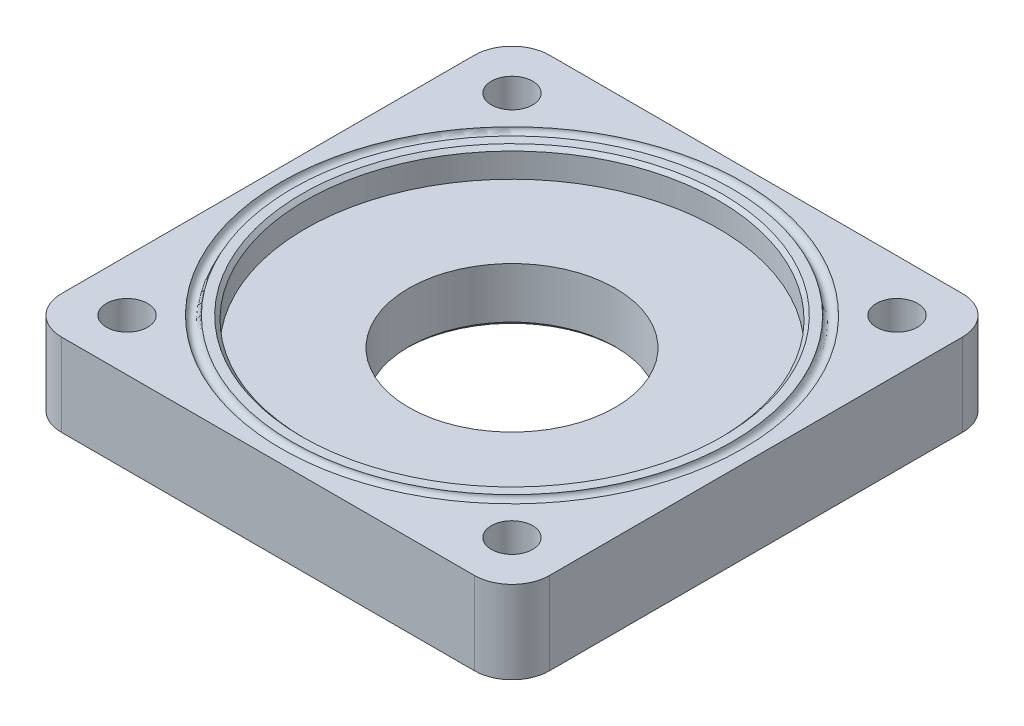
ISO-10303-21;
HEADER;
FILE_DESCRIPTION(('STEP AP214'),'2;1');
FILE_NAME('part.step','',(''),(''),'','','');
FILE_SCHEMA(('AUTOMOTIVE_DESIGN { 1 0 10303 214 1 1 1 1 }'));
ENDSEC;
DATA;
#1=APPLICATION_CONTEXT('core data for automotive mechanical design processes');
#2=APPLICATION_PROTOCOL_DEFINITION('international standard','automotive_design',2000,#1);
#3=PRODUCT_CONTEXT('',#1,'mechanical');
#4=PRODUCT('Part','Part','',(#3));
#5=PRODUCT_RELATED_PRODUCT_CATEGORY('part','',(#4));
#6=PRODUCT_DEFINITION_FORMATION('','',#4);
#7=PRODUCT_DEFINITION_CONTEXT('part definition',#1,'design');
#8=PRODUCT_DEFINITION('design','',#6,#7);
#9=PRODUCT_DEFINITION_SHAPE('','',#8);
#10=(LENGTH_UNIT() NAMED_UNIT(*) SI_UNIT(.MILLI.,.METRE.));
#11=(NAMED_UNIT(*) PLANE_ANGLE_UNIT() SI_UNIT($,.RADIAN.));
#12=(NAMED_UNIT(*) SI_UNIT($,.STERADIAN.) SOLID_ANGLE_UNIT());
#13=UNCERTAINTY_MEASURE_WITH_UNIT(LENGTH_MEASURE(1.E-05),#10,'distance_accuracy_value','');
#14=(GEOMETRIC_REPRESENTATION_CONTEXT(3) GLOBAL_UNCERTAINTY_ASSIGNED_CONTEXT((#13)) GLOBAL_UNIT_ASSIGNED_CONTEXT((#10,
#11,#12)) REPRESENTATION_CONTEXT('',''));
#15=CARTESIAN_POINT('',(0.,0.,0.));
#16=DIRECTION('',(0.,0.,1.));
#17=DIRECTION('',(1.,0.,0.));
#18=AXIS2_PLACEMENT_3D('',#15,#16,#17);
#19=CARTESIAN_POINT('',(0.,22.,0.));
#20=DIRECTION('',(0.,-1.,0.));
#21=DIRECTION('',(0.,0.,-1.));
#22=AXIS2_PLACEMENT_3D('',#19,#20,#21);
#23=PLANE('',#22);
#24=CARTESIAN_POINT('',(-51.2652416360247,22.,51.2652416360247));
#25=DIRECTION('',(0.,1.,0.));
#26=DIRECTION('',(0.,0.,1.));
#27=AXIS2_PLACEMENT_3D('',#24,#25,#26);
#28=CIRCLE('',#27,5.5);
#29=CARTESIAN_POINT('',(-51.2652416360247,22.,56.7652416360247));
#30=VERTEX_POINT('',#29);
#31=EDGE_CURVE('E332',#30,#30,#28,.T.);
#32=ORIENTED_EDGE('',*,*,#31,.F.);
#33=EDGE_LOOP('',(#32));
#34=FACE_BOUND('',#33,.T.);
#35=CARTESIAN_POINT('',(51.2652416360247,22.,51.2652416360247));
#36=DIRECTION('',(0.,1.,0.));
#37=DIRECTION('',(0.,0.,1.));
#38=AXIS2_PLACEMENT_3D('',#35,#36,#37);
#39=CIRCLE('',#38,5.5);
#40=CARTESIAN_POINT('',(51.2652416360247,22.,56.7652416360247));
#41=VERTEX_POINT('',#40);
#42=EDGE_CURVE('E326',#41,#41,#39,.T.);
#43=ORIENTED_EDGE('',*,*,#42,.F.);
#44=EDGE_LOOP('',(#43));
#45=FACE_BOUND('',#44,.T.);
#46=CARTESIAN_POINT('',(-51.2652416360247,22.,-51.2652416360247));
#47=DIRECTION('',(0.,1.,0.));
#48=DIRECTION('',(0.,0.,1.));
#49=AXIS2_PLACEMENT_3D('',#46,#47,#48);
#50=CIRCLE('',#49,5.5);
#51=CARTESIAN_POINT('',(-51.2652416360247,22.,-45.7652416360247));
#52=VERTEX_POINT('',#51);
#53=EDGE_CURVE('E321',#52,#52,#50,.T.);
#54=ORIENTED_EDGE('',*,*,#53,.F.);
#55=EDGE_LOOP('',(#54));
#56=FACE_BOUND('',#55,.T.);
#57=CARTESIAN_POINT('',(51.2652416360247,22.,-51.2652416360247));
#58=DIRECTION('',(0.,1.,0.));
#59=DIRECTION('',(0.,0.,1.));
#60=AXIS2_PLACEMENT_3D('',#57,#58,#59);
#61=CIRCLE('',#60,5.5);
#62=CARTESIAN_POINT('',(51.2652416360247,22.,-45.7652416360247));
#63=VERTEX_POINT('',#62);
#64=EDGE_CURVE('E315',#63,#63,#61,.T.);
#65=ORIENTED_EDGE('',*,*,#64,.F.);
#66=EDGE_LOOP('',(#65));
#67=FACE_BOUND('',#66,.T.);
#68=DIRECTION('',(0.,0.,-1.));
#69=VECTOR('',#68,1.);
#70=CARTESIAN_POINT('',(65.,22.,65.));
#71=LINE('',#70,#69);
#72=CARTESIAN_POINT('',(65.,22.,55.));
#73=VERTEX_POINT('',#72);
#74=CARTESIAN_POINT('',(65.,22.,-55.));
#75=VERTEX_POINT('',#74);
#76=EDGE_CURVE('E154',#73,#75,#71,.T.);
#77=ORIENTED_EDGE('',*,*,#76,.T.);
#78=CARTESIAN_POINT('',(55.,22.,-55.));
#79=DIRECTION('',(0.,-1.,0.));
#80=DIRECTION('',(0.,0.,-1.));
#81=AXIS2_PLACEMENT_3D('',#78,#79,#80);
#82=CIRCLE('',#81,10.);
#83=CARTESIAN_POINT('',(55.,22.,-65.));
#84=VERTEX_POINT('',#83);
#85=EDGE_CURVE('E186',#75,#84,#82,.F.);
#86=ORIENTED_EDGE('',*,*,#85,.T.);
#87=DIRECTION('',(-1.,0.,0.));
#88=VECTOR('',#87,1.);
#89=CARTESIAN_POINT('',(-65.,22.,-65.));
#90=LINE('',#89,#88);
#91=CARTESIAN_POINT('',(-55.,22.,-65.));
#92=VERTEX_POINT('',#91);
#93=EDGE_CURVE('E303',#84,#92,#90,.T.);
#94=ORIENTED_EDGE('',*,*,#93,.T.);
#95=CARTESIAN_POINT('',(-55.,22.,-55.));
#96=DIRECTION('',(0.,-1.,0.));
#97=DIRECTION('',(0.,0.,-1.));
#98=AXIS2_PLACEMENT_3D('',#95,#96,#97);
#99=CIRCLE('',#98,10.);
#100=CARTESIAN_POINT('',(-65.,22.,-55.));
#101=VERTEX_POINT('',#100);
#102=EDGE_CURVE('E184',#92,#101,#99,.F.);
#103=ORIENTED_EDGE('',*,*,#102,.T.);
#104=DIRECTION('',(0.,0.,1.));
#105=VECTOR('',#104,1.);
#106=CARTESIAN_POINT('',(-65.,22.,65.));
#107=LINE('',#106,#105);
#108=CARTESIAN_POINT('',(-65.,22.,55.));
#109=VERTEX_POINT('',#108);
#110=EDGE_CURVE('E306',#101,#109,#107,.T.);
#111=ORIENTED_EDGE('',*,*,#110,.T.);
#112=CARTESIAN_POINT('',(-55.,22.,55.));
#113=DIRECTION('',(0.,-1.,0.));
#114=DIRECTION('',(0.,0.,-1.));
#115=AXIS2_PLACEMENT_3D('',#112,#113,#114);
#116=CIRCLE('',#115,10.);
#117=CARTESIAN_POINT('',(-55.,22.,65.));
#118=VERTEX_POINT('',#117);
#119=EDGE_CURVE('E182',#109,#118,#116,.F.);
#120=ORIENTED_EDGE('',*,*,#119,.T.);
#121=DIRECTION('',(1.,0.,0.));
#122=VECTOR('',#121,1.);
#123=CARTESIAN_POINT('',(-65.,22.,65.));
#124=LINE('',#123,#122);
#125=CARTESIAN_POINT('',(55.,22.,65.));
#126=VERTEX_POINT('',#125);
#127=EDGE_CURVE('E163',#118,#126,#124,.T.);
#128=ORIENTED_EDGE('',*,*,#127,.T.);
#129=CARTESIAN_POINT('',(55.,22.,55.));
#130=DIRECTION('',(0.,-1.,0.));
#131=DIRECTION('',(0.,0.,-1.));
#132=AXIS2_PLACEMENT_3D('',#129,#130,#131);
#133=CIRCLE('',#132,10.);
#134=EDGE_CURVE('E180',#126,#73,#133,.F.);
#135=ORIENTED_EDGE('',*,*,#134,.T.);
#136=EDGE_LOOP('',(#77,#86,#94,#103,#111,#120,#128,#135));
#137=FACE_BOUND('',#136,.T.);
#138=CARTESIAN_POINT('',(0.,22.,0.));
#139=DIRECTION('',(0.,-1.,0.));
#140=DIRECTION('',(0.,0.,-1.));
#141=AXIS2_PLACEMENT_3D('',#138,#139,#140);
#142=CIRCLE('',#141,61.5);
#143=CARTESIAN_POINT('',(61.5,22.,0.));
#144=VERTEX_POINT('',#143);
#145=EDGE_CURVE('E209',#144,#144,#142,.F.);
#146=ORIENTED_EDGE('',*,*,#145,.F.);
#147=EDGE_LOOP('',(#146));
#148=FACE_BOUND('',#147,.T.);
#149=ADVANCED_FACE('F34',(#34,#45,#56,#67,#137,#148),#23,.F.);
#150=CARTESIAN_POINT('',(0.,22.,0.));
#151=DIRECTION('',(0.,-1.,0.));
#152=DIRECTION('',(0.,0.,-1.));
#153=AXIS2_PLACEMENT_3D('',#150,#151,#152);
#154=CIRCLE('',#153,55.9999999999999);
#155=CARTESIAN_POINT('',(0.,22.,-55.9999999999999));
#156=VERTEX_POINT('',#155);
#157=EDGE_CURVE('E11',#156,#156,#154,.T.);
#158=ORIENTED_EDGE('',*,*,#157,.T.);
#159=EDGE_LOOP('',(#158));
#160=FACE_BOUND('',#159,.T.);
#161=CARTESIAN_POINT('',(0.,22.,0.));
#162=DIRECTION('',(0.,1.,0.));
#163=DIRECTION('',(0.,0.,1.));
#164=AXIS2_PLACEMENT_3D('',#161,#162,#163);
#165=CIRCLE('',#164,58.5);
#166=CARTESIAN_POINT('',(58.5,22.,0.));
#167=VERTEX_POINT('',#166);
#168=EDGE_CURVE('E207',#167,#167,#165,.F.);
#169=ORIENTED_EDGE('',*,*,#168,.F.);
#170=EDGE_LOOP('',(#169));
#171=FACE_BOUND('',#170,.T.);
#172=ADVANCED_FACE('F232',(#160,#171),#23,.F.);
#173=CARTESIAN_POINT('',(0.,0.,0.));
#174=DIRECTION('',(0.,-1.,0.));
#175=DIRECTION('',(0.,0.,-1.));
#176=AXIS2_PLACEMENT_3D('',#173,#174,#175);
#177=PLANE('',#176);
#178=CARTESIAN_POINT('',(51.2652416360247,0.,51.2652416360247));
#179=DIRECTION('',(0.,1.,0.));
#180=DIRECTION('',(0.,0.,1.));
#181=AXIS2_PLACEMENT_3D('',#178,#179,#180);
#182=CIRCLE('',#181,5.5);
#183=CARTESIAN_POINT('',(51.2652416360247,0.,56.7652416360247));
#184=VERTEX_POINT('',#183);
#185=EDGE_CURVE('E329',#184,#184,#182,.T.);
#186=ORIENTED_EDGE('',*,*,#185,.T.);
#187=EDGE_LOOP('',(#186));
#188=FACE_BOUND('',#187,.T.);
#189=CARTESIAN_POINT('',(51.2652416360247,0.,-51.2652416360247));
#190=DIRECTION('',(0.,1.,0.));
#191=DIRECTION('',(0.,0.,1.));
#192=AXIS2_PLACEMENT_3D('',#189,#190,#191);
#193=CIRCLE('',#192,5.5);
#194=CARTESIAN_POINT('',(51.2652416360247,0.,-45.7652416360247));
#195=VERTEX_POINT('',#194);
#196=EDGE_CURVE('E309',#195,#195,#193,.T.);
#197=ORIENTED_EDGE('',*,*,#196,.T.);
#198=EDGE_LOOP('',(#197));
#199=FACE_BOUND('',#198,.T.);
#200=CARTESIAN_POINT('',(-51.2652416360247,0.,-51.2652416360247));
#201=DIRECTION('',(0.,1.,0.));
#202=DIRECTION('',(0.,0.,1.));
#203=AXIS2_PLACEMENT_3D('',#200,#201,#202);
#204=CIRCLE('',#203,5.5);
#205=CARTESIAN_POINT('',(-51.2652416360247,0.,-45.7652416360247));
#206=VERTEX_POINT('',#205);
#207=EDGE_CURVE('E323',#206,#206,#204,.T.);
#208=ORIENTED_EDGE('',*,*,#207,.T.);
#209=EDGE_LOOP('',(#208));
#210=FACE_BOUND('',#209,.T.);
#211=CARTESIAN_POINT('',(-51.2652416360247,0.,51.2652416360247));
#212=DIRECTION('',(0.,1.,0.));
#213=DIRECTION('',(0.,0.,1.));
#214=AXIS2_PLACEMENT_3D('',#211,#212,#213);
#215=CIRCLE('',#214,5.5);
#216=CARTESIAN_POINT('',(-51.2652416360247,0.,56.7652416360247));
#217=VERTEX_POINT('',#216);
#218=EDGE_CURVE('E200',#217,#217,#215,.T.);
#219=ORIENTED_EDGE('',*,*,#218,.T.);
#220=EDGE_LOOP('',(#219));
#221=FACE_BOUND('',#220,.T.);
#222=CARTESIAN_POINT('',(0.,0.,0.));
#223=DIRECTION('',(0.,-1.,0.));
#224=DIRECTION('',(0.,0.,-1.));
#225=AXIS2_PLACEMENT_3D('',#222,#223,#224);
#226=CIRCLE('',#225,34.);
#227=CARTESIAN_POINT('',(34.,0.,0.));
#228=VERTEX_POINT('',#227);
#229=EDGE_CURVE('E204',#228,#228,#226,.T.);
#230=ORIENTED_EDGE('',*,*,#229,.F.);
#231=EDGE_LOOP('',(#230));
#232=FACE_BOUND('',#231,.T.);
#233=DIRECTION('',(0.,0.,1.));
#234=VECTOR('',#233,1.);
#235=CARTESIAN_POINT('',(-40.,0.,-22.5));
#236=LINE('',#235,#234);
#237=CARTESIAN_POINT('',(-40.,0.,-22.5));
#238=VERTEX_POINT('',#237);
#239=CARTESIAN_POINT('',(-40.,0.,22.5));
#240=VERTEX_POINT('',#239);
#241=EDGE_CURVE('E143',#238,#240,#236,.T.);
#242=ORIENTED_EDGE('',*,*,#241,.F.);
#243=DIRECTION('',(1.,0.,0.));
#244=VECTOR('',#243,1.);
#245=CARTESIAN_POINT('',(-65.,0.,-22.5));
#246=LINE('',#245,#244);
#247=CARTESIAN_POINT('',(-65.,0.,-22.5));
#248=VERTEX_POINT('',#247);
#249=EDGE_CURVE('E129',#248,#238,#246,.T.);
#250=ORIENTED_EDGE('',*,*,#249,.F.);
#251=DIRECTION('',(0.,0.,1.));
#252=VECTOR('',#251,1.);
#253=CARTESIAN_POINT('',(-65.,0.,65.));
#254=LINE('',#253,#252);
#255=CARTESIAN_POINT('',(-65.,0.,-55.));
#256=VERTEX_POINT('',#255);
#257=EDGE_CURVE('E141',#256,#248,#254,.T.);
#258=ORIENTED_EDGE('',*,*,#257,.F.);
#259=CARTESIAN_POINT('',(-55.,0.,-55.));
#260=DIRECTION('',(0.,-1.,0.));
#261=DIRECTION('',(0.,0.,-1.));
#262=AXIS2_PLACEMENT_3D('',#259,#260,#261);
#263=CIRCLE('',#262,10.);
#264=CARTESIAN_POINT('',(-55.,0.,-65.));
#265=VERTEX_POINT('',#264);
#266=EDGE_CURVE('E171',#256,#265,#263,.T.);
#267=ORIENTED_EDGE('',*,*,#266,.T.);
#268=DIRECTION('',(-1.,0.,0.));
#269=VECTOR('',#268,1.);
#270=CARTESIAN_POINT('',(-65.,0.,-65.));
#271=LINE('',#270,#269);
#272=CARTESIAN_POINT('',(55.,0.,-65.));
#273=VERTEX_POINT('',#272);
#274=EDGE_CURVE('E156',#273,#265,#271,.T.);
#275=ORIENTED_EDGE('',*,*,#274,.F.);
#276=CARTESIAN_POINT('',(55.,0.,-55.));
#277=DIRECTION('',(0.,-1.,0.));
#278=DIRECTION('',(0.,0.,-1.));
#279=AXIS2_PLACEMENT_3D('',#276,#277,#278);
#280=CIRCLE('',#279,10.);
#281=CARTESIAN_POINT('',(65.,0.,-55.));
#282=VERTEX_POINT('',#281);
#283=EDGE_CURVE('E173',#273,#282,#280,.T.);
#284=ORIENTED_EDGE('',*,*,#283,.T.);
#285=DIRECTION('',(0.,0.,-1.));
#286=VECTOR('',#285,1.);
#287=CARTESIAN_POINT('',(65.,0.,65.));
#288=LINE('',#287,#286);
#289=CARTESIAN_POINT('',(65.,0.,55.));
#290=VERTEX_POINT('',#289);
#291=EDGE_CURVE('E314',#290,#282,#288,.T.);
#292=ORIENTED_EDGE('',*,*,#291,.F.);
#293=CARTESIAN_POINT('',(55.,0.,55.));
#294=DIRECTION('',(0.,-1.,0.));
#295=DIRECTION('',(0.,0.,-1.));
#296=AXIS2_PLACEMENT_3D('',#293,#294,#295);
#297=CIRCLE('',#296,10.);
#298=CARTESIAN_POINT('',(55.,0.,65.));
#299=VERTEX_POINT('',#298);
#300=EDGE_CURVE('E166',#290,#299,#297,.T.);
#301=ORIENTED_EDGE('',*,*,#300,.T.);
#302=DIRECTION('',(1.,0.,0.));
#303=VECTOR('',#302,1.);
#304=CARTESIAN_POINT('',(-65.,0.,65.));
#305=LINE('',#304,#303);
#306=CARTESIAN_POINT('',(-55.,0.,65.));
#307=VERTEX_POINT('',#306);
#308=EDGE_CURVE('E150',#307,#299,#305,.T.);
#309=ORIENTED_EDGE('',*,*,#308,.F.);
#310=CARTESIAN_POINT('',(-55.,0.,55.));
#311=DIRECTION('',(0.,-1.,0.));
#312=DIRECTION('',(0.,0.,-1.));
#313=AXIS2_PLACEMENT_3D('',#310,#311,#312);
#314=CIRCLE('',#313,10.);
#315=CARTESIAN_POINT('',(-65.,0.,55.));
#316=VERTEX_POINT('',#315);
#317=EDGE_CURVE('E168',#307,#316,#314,.T.);
#318=ORIENTED_EDGE('',*,*,#317,.T.);
#319=CARTESIAN_POINT('',(-65.,0.,22.5));
#320=VERTEX_POINT('',#319);
#321=EDGE_CURVE('E151',#320,#316,#254,.T.);
#322=ORIENTED_EDGE('',*,*,#321,.F.);
#323=DIRECTION('',(1.,0.,0.));
#324=VECTOR('',#323,1.);
#325=CARTESIAN_POINT('',(-65.,0.,22.5));
#326=LINE('',#325,#324);
#327=EDGE_CURVE('E348',#320,#240,#326,.T.);
#328=ORIENTED_EDGE('',*,*,#327,.T.);
#329=EDGE_LOOP('',(#242,#250,#258,#267,#275,#284,#292,#301,#309,#318,#322,#328));
#330=FACE_BOUND('',#329,.T.);
#331=ADVANCED_FACE('F140',(#188,#199,#210,#221,#232,#330),#177,.T.);
#332=CARTESIAN_POINT('',(-65.,22.,65.));
#333=DIRECTION('',(1.,0.,0.));
#334=DIRECTION('',(0.,0.,-1.));
#335=AXIS2_PLACEMENT_3D('',#332,#333,#334);
#336=PLANE('',#335);
#337=DIRECTION('',(0.,-1.,0.));
#338=VECTOR('',#337,1.);
#339=CARTESIAN_POINT('',(-65.,11.,-22.5));
#340=LINE('',#339,#338);
#341=CARTESIAN_POINT('',(-65.,11.,-22.5));
#342=VERTEX_POINT('',#341);
#343=EDGE_CURVE('E126',#342,#248,#340,.T.);
#344=ORIENTED_EDGE('',*,*,#343,.F.);
#345=DIRECTION('',(0.,0.,1.));
#346=VECTOR('',#345,1.);
#347=CARTESIAN_POINT('',(-65.,11.,-22.5));
#348=LINE('',#347,#346);
#349=CARTESIAN_POINT('',(-65.,11.,22.5));
#350=VERTEX_POINT('',#349);
#351=EDGE_CURVE('E343',#342,#350,#348,.T.);
#352=ORIENTED_EDGE('',*,*,#351,.T.);
#353=DIRECTION('',(0.,-1.,0.));
#354=VECTOR('',#353,1.);
#355=CARTESIAN_POINT('',(-65.,11.,22.5));
#356=LINE('',#355,#354);
#357=EDGE_CURVE('E350',#350,#320,#356,.T.);
#358=ORIENTED_EDGE('',*,*,#357,.T.);
#359=ORIENTED_EDGE('',*,*,#321,.T.);
#360=DIRECTION('',(0.,-1.,0.));
#361=VECTOR('',#360,1.);
#362=CARTESIAN_POINT('',(-65.,22.,55.));
#363=LINE('',#362,#361);
#364=EDGE_CURVE('E188',#316,#109,#363,.F.);
#365=ORIENTED_EDGE('',*,*,#364,.T.);
#366=ORIENTED_EDGE('',*,*,#110,.F.);
#367=DIRECTION('',(0.,-1.,0.));
#368=VECTOR('',#367,1.);
#369=CARTESIAN_POINT('',(-65.,22.,-55.));
#370=LINE('',#369,#368);
#371=EDGE_CURVE('E149',#101,#256,#370,.T.);
#372=ORIENTED_EDGE('',*,*,#371,.T.);
#373=ORIENTED_EDGE('',*,*,#257,.T.);
#374=EDGE_LOOP('',(#344,#352,#358,#359,#365,#366,#372,#373));
#375=FACE_BOUND('',#374,.T.);
#376=ADVANCED_FACE('F146',(#375),#336,.F.);
#377=CARTESIAN_POINT('',(0.,0.,0.));
#378=DIRECTION('',(0.,-1.,0.));
#379=DIRECTION('',(0.,0.,-1.));
#380=AXIS2_PLACEMENT_3D('',#377,#378,#379);
#381=CIRCLE('',#380,28.5);
#382=CARTESIAN_POINT('',(0.,0.,-28.5));
#383=VERTEX_POINT('',#382);
#384=EDGE_CURVE('E211',#383,#383,#381,.F.);
#385=ORIENTED_EDGE('',*,*,#384,.T.);
#386=EDGE_LOOP('',(#385));
#387=FACE_BOUND('',#386,.T.);
#388=CARTESIAN_POINT('',(0.,0.,0.));
#389=DIRECTION('',(0.,1.,0.));
#390=DIRECTION('',(0.,0.,1.));
#391=AXIS2_PLACEMENT_3D('',#388,#389,#390);
#392=CIRCLE('',#391,31.);
#393=CARTESIAN_POINT('',(31.,0.,0.));
#394=VERTEX_POINT('',#393);
#395=EDGE_CURVE('E196',#394,#394,#392,.T.);
#396=ORIENTED_EDGE('',*,*,#395,.F.);
#397=EDGE_LOOP('',(#396));
#398=FACE_BOUND('',#397,.T.);
#399=ADVANCED_FACE('F248',(#387,#398),#177,.T.);
#400=CARTESIAN_POINT('',(0.,22.,0.));
#401=DIRECTION('',(0.,-1.,0.));
#402=DIRECTION('',(0.,0.,-1.));
#403=AXIS2_PLACEMENT_3D('',#400,#401,#402);
#404=CYLINDRICAL_SURFACE('',#403,27.5);
#405=CARTESIAN_POINT('',(0.,0.999999999999987,0.));
#406=DIRECTION('',(0.,-1.,0.));
#407=DIRECTION('',(0.,0.,-1.));
#408=AXIS2_PLACEMENT_3D('',#405,#406,#407);
#409=CIRCLE('',#408,27.5);
#410=CARTESIAN_POINT('',(0.,0.999999999999987,-27.5));
#411=VERTEX_POINT('',#410);
#412=EDGE_CURVE('E214',#411,#411,#409,.T.);
#413=ORIENTED_EDGE('',*,*,#412,.T.);
#414=EDGE_LOOP('',(#413));
#415=FACE_BOUND('',#414,.T.);
#416=CARTESIAN_POINT('',(0.,14.5,0.));
#417=DIRECTION('',(0.,1.,0.));
#418=DIRECTION('',(0.,0.,1.));
#419=AXIS2_PLACEMENT_3D('',#416,#417,#418);
#420=CIRCLE('',#419,27.5);
#421=CARTESIAN_POINT('',(0.,14.5,27.5));
#422=VERTEX_POINT('',#421);
#423=EDGE_CURVE('E197',#422,#422,#420,.T.);
#424=ORIENTED_EDGE('',*,*,#423,.T.);
#425=EDGE_LOOP('',(#424));
#426=FACE_BOUND('',#425,.T.);
#427=ADVANCED_FACE('F262',(#415,#426),#404,.F.);
#428=CARTESIAN_POINT('',(65.,22.,65.));
#429=DIRECTION('',(-1.,0.,0.));
#430=DIRECTION('',(0.,0.,1.));
#431=AXIS2_PLACEMENT_3D('',#428,#429,#430);
#432=PLANE('',#431);
#433=ORIENTED_EDGE('',*,*,#291,.T.);
#434=DIRECTION('',(0.,-1.,0.));
#435=VECTOR('',#434,1.);
#436=CARTESIAN_POINT('',(65.,22.,-55.));
#437=LINE('',#436,#435);
#438=EDGE_CURVE('E178',#282,#75,#437,.F.);
#439=ORIENTED_EDGE('',*,*,#438,.T.);
#440=ORIENTED_EDGE('',*,*,#76,.F.);
#441=DIRECTION('',(0.,-1.,0.));
#442=VECTOR('',#441,1.);
#443=CARTESIAN_POINT('',(65.,22.,55.));
#444=LINE('',#443,#442);
#445=EDGE_CURVE('E175',#73,#290,#444,.T.);
#446=ORIENTED_EDGE('',*,*,#445,.T.);
#447=EDGE_LOOP('',(#433,#439,#440,#446));
#448=FACE_BOUND('',#447,.T.);
#449=ADVANCED_FACE('F258',(#448),#432,.F.);
#450=CARTESIAN_POINT('',(-65.,22.,-65.));
#451=DIRECTION('',(0.,0.,1.));
#452=DIRECTION('',(1.,0.,0.));
#453=AXIS2_PLACEMENT_3D('',#450,#451,#452);
#454=PLANE('',#453);
#455=ORIENTED_EDGE('',*,*,#93,.F.);
#456=DIRECTION('',(0.,-1.,0.));
#457=VECTOR('',#456,1.);
#458=CARTESIAN_POINT('',(55.,22.,-65.));
#459=LINE('',#458,#457);
#460=EDGE_CURVE('E162',#84,#273,#459,.T.);
#461=ORIENTED_EDGE('',*,*,#460,.T.);
#462=ORIENTED_EDGE('',*,*,#274,.T.);
#463=DIRECTION('',(0.,-1.,0.));
#464=VECTOR('',#463,1.);
#465=CARTESIAN_POINT('',(-55.,22.,-65.));
#466=LINE('',#465,#464);
#467=EDGE_CURVE('E160',#265,#92,#466,.F.);
#468=ORIENTED_EDGE('',*,*,#467,.T.);
#469=EDGE_LOOP('',(#455,#461,#462,#468));
#470=FACE_BOUND('',#469,.T.);
#471=ADVANCED_FACE('F252',(#470),#454,.F.);
#472=CARTESIAN_POINT('',(-65.,22.,65.));
#473=DIRECTION('',(0.,0.,-1.));
#474=DIRECTION('',(-1.,0.,0.));
#475=AXIS2_PLACEMENT_3D('',#472,#473,#474);
#476=PLANE('',#475);
#477=ORIENTED_EDGE('',*,*,#127,.F.);
#478=DIRECTION('',(0.,-1.,0.));
#479=VECTOR('',#478,1.);
#480=CARTESIAN_POINT('',(-55.,22.,65.));
#481=LINE('',#480,#479);
#482=EDGE_CURVE('E193',#118,#307,#481,.T.);
#483=ORIENTED_EDGE('',*,*,#482,.T.);
#484=ORIENTED_EDGE('',*,*,#308,.T.);
#485=DIRECTION('',(0.,-1.,0.));
#486=VECTOR('',#485,1.);
#487=CARTESIAN_POINT('',(55.,22.,65.));
#488=LINE('',#487,#486);
#489=EDGE_CURVE('E191',#299,#126,#488,.F.);
#490=ORIENTED_EDGE('',*,*,#489,.T.);
#491=EDGE_LOOP('',(#477,#483,#484,#490));
#492=FACE_BOUND('',#491,.T.);
#493=ADVANCED_FACE('F249',(#492),#476,.F.);
#494=CARTESIAN_POINT('',(51.2652416360247,22.,-51.2652416360247));
#495=DIRECTION('',(0.,-1.,0.));
#496=DIRECTION('',(0.,0.,-1.));
#497=AXIS2_PLACEMENT_3D('',#494,#495,#496);
#498=CYLINDRICAL_SURFACE('',#497,5.5);
#499=ORIENTED_EDGE('',*,*,#64,.T.);
#500=EDGE_LOOP('',(#499));
#501=FACE_BOUND('',#500,.T.);
#502=ORIENTED_EDGE('',*,*,#196,.F.);
#503=EDGE_LOOP('',(#502));
#504=FACE_BOUND('',#503,.T.);
#505=ADVANCED_FACE('F243',(#501,#504),#498,.F.);
#506=CARTESIAN_POINT('',(-51.2652416360247,22.,-51.2652416360247));
#507=DIRECTION('',(0.,-1.,0.));
#508=DIRECTION('',(0.,0.,-1.));
#509=AXIS2_PLACEMENT_3D('',#506,#507,#508);
#510=CYLINDRICAL_SURFACE('',#509,5.5);
#511=ORIENTED_EDGE('',*,*,#53,.T.);
#512=EDGE_LOOP('',(#511));
#513=FACE_BOUND('',#512,.T.);
#514=ORIENTED_EDGE('',*,*,#207,.F.);
#515=EDGE_LOOP('',(#514));
#516=FACE_BOUND('',#515,.T.);
#517=ADVANCED_FACE('F392',(#513,#516),#510,.F.);
#518=CARTESIAN_POINT('',(51.2652416360247,22.,51.2652416360247));
#519=DIRECTION('',(0.,-1.,0.));
#520=DIRECTION('',(0.,0.,-1.));
#521=AXIS2_PLACEMENT_3D('',#518,#519,#520);
#522=CYLINDRICAL_SURFACE('',#521,5.5);
#523=ORIENTED_EDGE('',*,*,#42,.T.);
#524=EDGE_LOOP('',(#523));
#525=FACE_BOUND('',#524,.T.);
#526=ORIENTED_EDGE('',*,*,#185,.F.);
#527=EDGE_LOOP('',(#526));
#528=FACE_BOUND('',#527,.T.);
#529=ADVANCED_FACE('F389',(#525,#528),#522,.F.);
#530=CARTESIAN_POINT('',(-51.2652416360247,22.,51.2652416360247));
#531=DIRECTION('',(0.,-1.,0.));
#532=DIRECTION('',(0.,0.,-1.));
#533=AXIS2_PLACEMENT_3D('',#530,#531,#532);
#534=CYLINDRICAL_SURFACE('',#533,5.5);
#535=ORIENTED_EDGE('',*,*,#31,.T.);
#536=EDGE_LOOP('',(#535));
#537=FACE_BOUND('',#536,.T.);
#538=ORIENTED_EDGE('',*,*,#218,.F.);
#539=EDGE_LOOP('',(#538));
#540=FACE_BOUND('',#539,.T.);
#541=ADVANCED_FACE('F268',(#537,#540),#534,.F.);
#542=CARTESIAN_POINT('',(55.,22.,-55.));
#543=DIRECTION('',(0.,-1.,0.));
#544=DIRECTION('',(0.,0.,-1.));
#545=AXIS2_PLACEMENT_3D('',#542,#543,#544);
#546=CYLINDRICAL_SURFACE('',#545,10.);
#547=ORIENTED_EDGE('',*,*,#85,.F.);
#548=ORIENTED_EDGE('',*,*,#438,.F.);
#549=ORIENTED_EDGE('',*,*,#283,.F.);
#550=ORIENTED_EDGE('',*,*,#460,.F.);
#551=EDGE_LOOP('',(#547,#548,#549,#550));
#552=FACE_BOUND('',#551,.T.);
#553=ADVANCED_FACE('F264',(#552),#546,.T.);
#554=CARTESIAN_POINT('',(-55.,22.,-55.));
#555=DIRECTION('',(0.,-1.,0.));
#556=DIRECTION('',(0.,0.,-1.));
#557=AXIS2_PLACEMENT_3D('',#554,#555,#556);
#558=CYLINDRICAL_SURFACE('',#557,10.);
#559=ORIENTED_EDGE('',*,*,#102,.F.);
#560=ORIENTED_EDGE('',*,*,#467,.F.);
#561=ORIENTED_EDGE('',*,*,#266,.F.);
#562=ORIENTED_EDGE('',*,*,#371,.F.);
#563=EDGE_LOOP('',(#559,#560,#561,#562));
#564=FACE_BOUND('',#563,.T.);
#565=ADVANCED_FACE('F267',(#564),#558,.T.);
#566=CARTESIAN_POINT('',(-55.,22.,55.));
#567=DIRECTION('',(0.,-1.,0.));
#568=DIRECTION('',(0.,0.,-1.));
#569=AXIS2_PLACEMENT_3D('',#566,#567,#568);
#570=CYLINDRICAL_SURFACE('',#569,10.);
#571=ORIENTED_EDGE('',*,*,#119,.F.);
#572=ORIENTED_EDGE('',*,*,#364,.F.);
#573=ORIENTED_EDGE('',*,*,#317,.F.);
#574=ORIENTED_EDGE('',*,*,#482,.F.);
#575=EDGE_LOOP('',(#571,#572,#573,#574));
#576=FACE_BOUND('',#575,.T.);
#577=ADVANCED_FACE('F272',(#576),#570,.T.);
#578=CARTESIAN_POINT('',(55.,22.,55.));
#579=DIRECTION('',(0.,-1.,0.));
#580=DIRECTION('',(0.,0.,-1.));
#581=AXIS2_PLACEMENT_3D('',#578,#579,#580);
#582=CYLINDRICAL_SURFACE('',#581,10.);
#583=ORIENTED_EDGE('',*,*,#134,.F.);
#584=ORIENTED_EDGE('',*,*,#489,.F.);
#585=ORIENTED_EDGE('',*,*,#300,.F.);
#586=ORIENTED_EDGE('',*,*,#445,.F.);
#587=EDGE_LOOP('',(#583,#584,#585,#586));
#588=FACE_BOUND('',#587,.T.);
#589=ADVANCED_FACE('F276',(#588),#582,.T.);
#590=CARTESIAN_POINT('',(0.,14.5,0.));
#591=DIRECTION('',(0.,1.,0.));
#592=DIRECTION('',(0.,0.,1.));
#593=AXIS2_PLACEMENT_3D('',#590,#591,#592);
#594=CYLINDRICAL_SURFACE('',#593,55.);
#595=CARTESIAN_POINT('',(0.,21.,0.));
#596=DIRECTION('',(0.,-1.,0.));
#597=DIRECTION('',(0.,0.,-1.));
#598=AXIS2_PLACEMENT_3D('',#595,#596,#597);
#599=CIRCLE('',#598,55.);
#600=CARTESIAN_POINT('',(0.,21.,-55.));
#601=VERTEX_POINT('',#600);
#602=EDGE_CURVE('E43',#601,#601,#599,.F.);
#603=ORIENTED_EDGE('',*,*,#602,.T.);
#604=EDGE_LOOP('',(#603));
#605=FACE_BOUND('',#604,.T.);
#606=CARTESIAN_POINT('',(0.,14.5,0.));
#607=DIRECTION('',(0.,1.,0.));
#608=DIRECTION('',(0.,0.,1.));
#609=AXIS2_PLACEMENT_3D('',#606,#607,#608);
#610=CIRCLE('',#609,55.);
#611=CARTESIAN_POINT('',(0.,14.5,55.));
#612=VERTEX_POINT('',#611);
#613=EDGE_CURVE('E201',#612,#612,#610,.T.);
#614=ORIENTED_EDGE('',*,*,#613,.F.);
#615=EDGE_LOOP('',(#614));
#616=FACE_BOUND('',#615,.T.);
#617=ADVANCED_FACE('F219',(#605,#616),#594,.F.);
#618=CARTESIAN_POINT('',(0.,14.5,0.));
#619=DIRECTION('',(0.,1.,0.));
#620=DIRECTION('',(0.,0.,1.));
#621=AXIS2_PLACEMENT_3D('',#618,#619,#620);
#622=PLANE('',#621);
#623=ORIENTED_EDGE('',*,*,#423,.F.);
#624=EDGE_LOOP('',(#623));
#625=FACE_BOUND('',#624,.T.);
#626=ORIENTED_EDGE('',*,*,#613,.T.);
#627=EDGE_LOOP('',(#626));
#628=FACE_BOUND('',#627,.T.);
#629=ADVANCED_FACE('F288',(#625,#628),#622,.T.);
#630=CARTESIAN_POINT('',(0.,0.,0.));
#631=DIRECTION('',(0.,-1.,0.));
#632=DIRECTION('',(0.,0.,-1.));
#633=AXIS2_PLACEMENT_3D('',#630,#631,#632);
#634=TOROIDAL_SURFACE('',#633,32.5,1.5);
#635=ORIENTED_EDGE('',*,*,#229,.T.);
#636=CARTESIAN_POINT('',(32.5,0.,0.));
#637=DIRECTION('',(0.,0.,1.));
#638=DIRECTION('',(1.,0.,0.));
#639=AXIS2_PLACEMENT_3D('',#636,#637,#638);
#640=CIRCLE('',#639,1.5);
#641=EDGE_CURVE('E341',#228,#394,#640,.T.);
#642=ORIENTED_EDGE('',*,*,#641,.T.);
#643=ORIENTED_EDGE('',*,*,#395,.T.);
#644=ORIENTED_EDGE('',*,*,#641,.F.);
#645=EDGE_LOOP('',(#635,#642,#643,#644));
#646=FACE_BOUND('',#645,.T.);
#647=ADVANCED_FACE('F370',(#646),#634,.F.);
#648=CARTESIAN_POINT('',(-40.,0.,-22.5));
#649=DIRECTION('',(0.402738614266017,0.915315032422766,0.));
#650=DIRECTION('',(-0.915315032422766,0.402738614266017,0.));
#651=AXIS2_PLACEMENT_3D('',#648,#649,#650);
#652=PLANE('',#651);
#653=DIRECTION('',(-0.915315032422765,0.402738614266017,0.));
#654=VECTOR('',#653,1.);
#655=CARTESIAN_POINT('',(-40.,0.,22.5));
#656=LINE('',#655,#654);
#657=EDGE_CURVE('E135',#240,#350,#656,.T.);
#658=ORIENTED_EDGE('',*,*,#657,.T.);
#659=ORIENTED_EDGE('',*,*,#351,.F.);
#660=DIRECTION('',(-0.915315032422765,0.402738614266017,0.));
#661=VECTOR('',#660,1.);
#662=CARTESIAN_POINT('',(-40.,0.,-22.5));
#663=LINE('',#662,#661);
#664=EDGE_CURVE('E131',#238,#342,#663,.T.);
#665=ORIENTED_EDGE('',*,*,#664,.F.);
#666=ORIENTED_EDGE('',*,*,#241,.T.);
#667=EDGE_LOOP('',(#658,#659,#665,#666));
#668=FACE_BOUND('',#667,.T.);
#669=ADVANCED_FACE('F368',(#668),#652,.F.);
#670=CARTESIAN_POINT('',(0.,0.,-22.5));
#671=DIRECTION('',(0.,0.,1.));
#672=DIRECTION('',(1.,0.,0.));
#673=AXIS2_PLACEMENT_3D('',#670,#671,#672);
#674=PLANE('',#673);
#675=ORIENTED_EDGE('',*,*,#343,.T.);
#676=ORIENTED_EDGE('',*,*,#249,.T.);
#677=ORIENTED_EDGE('',*,*,#664,.T.);
#678=EDGE_LOOP('',(#675,#676,#677));
#679=FACE_BOUND('',#678,.T.);
#680=ADVANCED_FACE('F128',(#679),#674,.T.);
#681=CARTESIAN_POINT('',(0.,0.,22.5));
#682=DIRECTION('',(0.,0.,1.));
#683=DIRECTION('',(1.,0.,0.));
#684=AXIS2_PLACEMENT_3D('',#681,#682,#683);
#685=PLANE('',#684);
#686=ORIENTED_EDGE('',*,*,#357,.F.);
#687=ORIENTED_EDGE('',*,*,#657,.F.);
#688=ORIENTED_EDGE('',*,*,#327,.F.);
#689=EDGE_LOOP('',(#686,#687,#688));
#690=FACE_BOUND('',#689,.T.);
#691=ADVANCED_FACE('F366',(#690),#685,.F.);
#692=CARTESIAN_POINT('',(0.,22.,0.));
#693=DIRECTION('',(0.,1.,0.));
#694=DIRECTION('',(0.,0.,1.));
#695=AXIS2_PLACEMENT_3D('',#692,#693,#694);
#696=TOROIDAL_SURFACE('',#695,60.,1.5);
#697=ORIENTED_EDGE('',*,*,#145,.T.);
#698=CARTESIAN_POINT('',(60.,22.,0.));
#699=DIRECTION('',(0.,0.,1.));
#700=DIRECTION('',(1.,0.,0.));
#701=AXIS2_PLACEMENT_3D('',#698,#699,#700);
#702=CIRCLE('',#701,1.5);
#703=EDGE_CURVE('E50',#167,#144,#702,.T.);
#704=ORIENTED_EDGE('',*,*,#703,.F.);
#705=ORIENTED_EDGE('',*,*,#168,.T.);
#706=ORIENTED_EDGE('',*,*,#703,.T.);
#707=EDGE_LOOP('',(#697,#704,#705,#706));
#708=FACE_BOUND('',#707,.T.);
#709=ADVANCED_FACE('F228',(#708),#696,.F.);
#710=CARTESIAN_POINT('',(0.,0.,0.));
#711=DIRECTION('',(0.,-1.,0.));
#712=DIRECTION('',(0.,0.,-1.));
#713=AXIS2_PLACEMENT_3D('',#710,#711,#712);
#714=CONICAL_SURFACE('',#713,28.5,0.785398163397433);
#715=ORIENTED_EDGE('',*,*,#412,.F.);
#716=EDGE_LOOP('',(#715));
#717=FACE_BOUND('',#716,.T.);
#718=ORIENTED_EDGE('',*,*,#384,.F.);
#719=EDGE_LOOP('',(#718));
#720=FACE_BOUND('',#719,.T.);
#721=ADVANCED_FACE('F223',(#717,#720),#714,.F.);
#722=CARTESIAN_POINT('',(0.,21.,0.));
#723=DIRECTION('',(0.,1.,0.));
#724=DIRECTION('',(0.,0.,1.));
#725=AXIS2_PLACEMENT_3D('',#722,#723,#724);
#726=CONICAL_SURFACE('',#725,55.,0.785398163397438);
#727=ORIENTED_EDGE('',*,*,#157,.F.);
#728=EDGE_LOOP('',(#727));
#729=FACE_BOUND('',#728,.T.);
#730=ORIENTED_EDGE('',*,*,#602,.F.);
#731=EDGE_LOOP('',(#730));
#732=FACE_BOUND('',#731,.T.);
#733=ADVANCED_FACE('F37',(#729,#732),#726,.F.);
#734=CLOSED_SHELL('',(#149,#172,#331,#376,#399,#427,#449,#471,#493,#505,#517,#529,#541,#553,
#565,#577,#589,#617,#629,#647,#669,#680,#691,#709,#721,#733));
#735=MANIFOLD_SOLID_BREP('B2',#734);
#736=ADVANCED_BREP_SHAPE_REPRESENTATION('',(#18,#735),#14);
#737=SHAPE_DEFINITION_REPRESENTATION(#9,#736);
ENDSEC;
END-ISO-10303-21;
